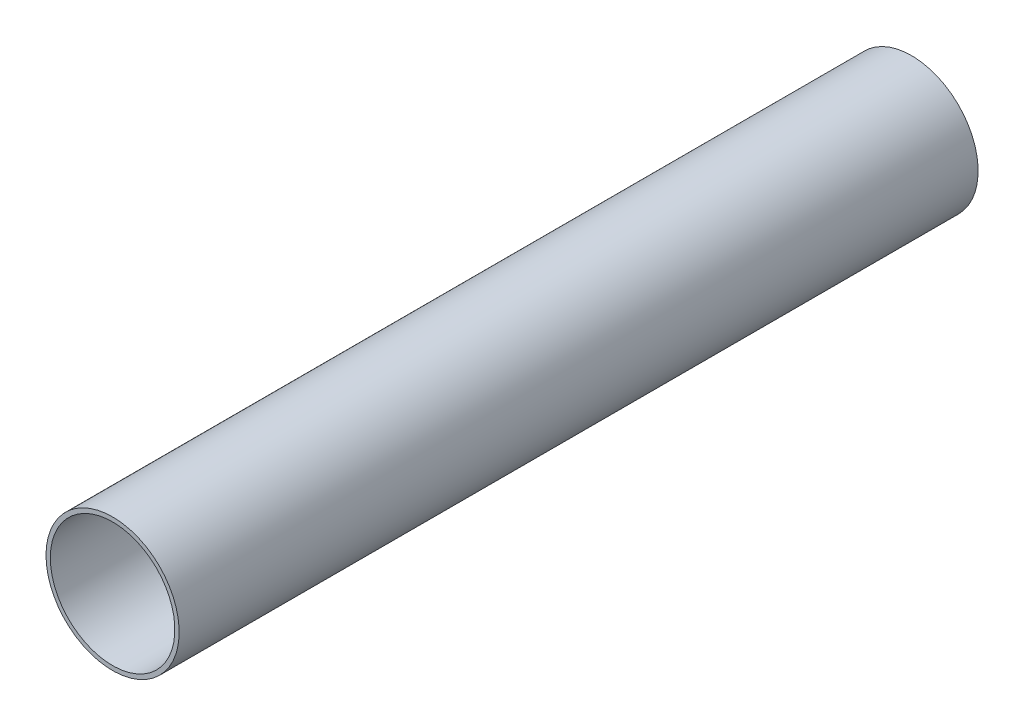
ISO-10303-21;
HEADER;
FILE_DESCRIPTION(('STEP AP214'),'2;1');
FILE_NAME('part.step','',(''),(''),'','','');
FILE_SCHEMA(('AUTOMOTIVE_DESIGN { 1 0 10303 214 1 1 1 1 }'));
ENDSEC;
DATA;
#1=APPLICATION_CONTEXT('core data for automotive mechanical design processes');
#2=APPLICATION_PROTOCOL_DEFINITION('international standard','automotive_design',2000,#1);
#3=PRODUCT_CONTEXT('',#1,'mechanical');
#4=PRODUCT('Part','Part','',(#3));
#5=PRODUCT_RELATED_PRODUCT_CATEGORY('part','',(#4));
#6=PRODUCT_DEFINITION_FORMATION('','',#4);
#7=PRODUCT_DEFINITION_CONTEXT('part definition',#1,'design');
#8=PRODUCT_DEFINITION('design','',#6,#7);
#9=PRODUCT_DEFINITION_SHAPE('','',#8);
#10=(LENGTH_UNIT() NAMED_UNIT(*) SI_UNIT(.MILLI.,.METRE.));
#11=(NAMED_UNIT(*) PLANE_ANGLE_UNIT() SI_UNIT($,.RADIAN.));
#12=(NAMED_UNIT(*) SI_UNIT($,.STERADIAN.) SOLID_ANGLE_UNIT());
#13=UNCERTAINTY_MEASURE_WITH_UNIT(LENGTH_MEASURE(1.E-05),#10,'distance_accuracy_value','');
#14=(GEOMETRIC_REPRESENTATION_CONTEXT(3) GLOBAL_UNCERTAINTY_ASSIGNED_CONTEXT((#13)) GLOBAL_UNIT_ASSIGNED_CONTEXT((#10,
#11,#12)) REPRESENTATION_CONTEXT('',''));
#15=CARTESIAN_POINT('',(0.,0.,0.));
#16=DIRECTION('',(0.,0.,1.));
#17=DIRECTION('',(1.,0.,0.));
#18=AXIS2_PLACEMENT_3D('',#15,#16,#17);
#19=CARTESIAN_POINT('',(0.,0.,152.4));
#20=DIRECTION('',(0.,0.,1.));
#21=DIRECTION('',(1.,0.,0.));
#22=AXIS2_PLACEMENT_3D('',#19,#20,#21);
#23=PLANE('',#22);
#24=CARTESIAN_POINT('',(0.,0.,152.4));
#25=DIRECTION('',(0.,0.,1.));
#26=DIRECTION('',(1.,0.,0.));
#27=AXIS2_PLACEMENT_3D('',#24,#25,#26);
#28=CIRCLE('',#27,25.4);
#29=CARTESIAN_POINT('',(-25.4,0.,152.4));
#30=VERTEX_POINT('',#29);
#31=EDGE_CURVE('E10',#30,#30,#28,.T.);
#32=ORIENTED_EDGE('',*,*,#31,.T.);
#33=EDGE_LOOP('',(#32));
#34=FACE_BOUND('',#33,.T.);
#35=CARTESIAN_POINT('',(0.,0.,152.4));
#36=DIRECTION('',(0.,0.,1.));
#37=DIRECTION('',(1.,0.,0.));
#38=AXIS2_PLACEMENT_3D('',#35,#36,#37);
#39=CIRCLE('',#38,23.749);
#40=CARTESIAN_POINT('',(-23.749,0.,152.4));
#41=VERTEX_POINT('',#40);
#42=EDGE_CURVE('E46',#41,#41,#39,.T.);
#43=ORIENTED_EDGE('',*,*,#42,.F.);
#44=EDGE_LOOP('',(#43));
#45=FACE_BOUND('',#44,.T.);
#46=ADVANCED_FACE('F35',(#34,#45),#23,.T.);
#47=CARTESIAN_POINT('',(0.,0.,-152.4));
#48=DIRECTION('',(0.,0.,1.));
#49=DIRECTION('',(1.,0.,0.));
#50=AXIS2_PLACEMENT_3D('',#47,#48,#49);
#51=PLANE('',#50);
#52=CARTESIAN_POINT('',(0.,0.,-152.4));
#53=DIRECTION('',(0.,0.,1.));
#54=DIRECTION('',(1.,0.,0.));
#55=AXIS2_PLACEMENT_3D('',#52,#53,#54);
#56=CIRCLE('',#55,25.4);
#57=CARTESIAN_POINT('',(-25.4,0.,-152.4));
#58=VERTEX_POINT('',#57);
#59=EDGE_CURVE('E39',#58,#58,#56,.T.);
#60=ORIENTED_EDGE('',*,*,#59,.F.);
#61=EDGE_LOOP('',(#60));
#62=FACE_BOUND('',#61,.T.);
#63=CARTESIAN_POINT('',(0.,0.,-152.4));
#64=DIRECTION('',(0.,0.,1.));
#65=DIRECTION('',(1.,0.,0.));
#66=AXIS2_PLACEMENT_3D('',#63,#64,#65);
#67=CIRCLE('',#66,23.749);
#68=CARTESIAN_POINT('',(-23.749,0.,-152.4));
#69=VERTEX_POINT('',#68);
#70=EDGE_CURVE('E48',#69,#69,#67,.T.);
#71=ORIENTED_EDGE('',*,*,#70,.T.);
#72=EDGE_LOOP('',(#71));
#73=FACE_BOUND('',#72,.T.);
#74=ADVANCED_FACE('F58',(#62,#73),#51,.F.);
#75=CARTESIAN_POINT('',(0.,0.,152.4));
#76=DIRECTION('',(0.,0.,-1.));
#77=DIRECTION('',(-1.,0.,0.));
#78=AXIS2_PLACEMENT_3D('',#75,#76,#77);
#79=CYLINDRICAL_SURFACE('',#78,25.4);
#80=CARTESIAN_POINT('',(-25.4,0.,152.4));
#81=CARTESIAN_POINT('',(-25.4,0.,149.225));
#82=CARTESIAN_POINT('',(-25.4,0.,146.05));
#83=CARTESIAN_POINT('',(-25.4,0.,139.7));
#84=CARTESIAN_POINT('',(-25.4,0.,136.525));
#85=CARTESIAN_POINT('',(-25.4,0.,130.175));
#86=CARTESIAN_POINT('',(-25.4,0.,127.));
#87=CARTESIAN_POINT('',(-25.4,0.,120.65));
#88=CARTESIAN_POINT('',(-25.4,0.,117.475));
#89=CARTESIAN_POINT('',(-25.4,0.,111.125));
#90=CARTESIAN_POINT('',(-25.4,0.,107.95));
#91=CARTESIAN_POINT('',(-25.4,0.,101.6));
#92=CARTESIAN_POINT('',(-25.4,0.,98.425));
#93=CARTESIAN_POINT('',(-25.4,0.,92.075));
#94=CARTESIAN_POINT('',(-25.4,0.,88.9));
#95=CARTESIAN_POINT('',(-25.4,0.,82.55));
#96=CARTESIAN_POINT('',(-25.4,0.,79.375));
#97=CARTESIAN_POINT('',(-25.4,0.,73.025));
#98=CARTESIAN_POINT('',(-25.4,0.,69.85));
#99=CARTESIAN_POINT('',(-25.4,0.,63.5));
#100=CARTESIAN_POINT('',(-25.4,0.,60.325));
#101=CARTESIAN_POINT('',(-25.4,0.,53.975));
#102=CARTESIAN_POINT('',(-25.4,0.,50.8));
#103=CARTESIAN_POINT('',(-25.4,0.,44.45));
#104=CARTESIAN_POINT('',(-25.4,0.,41.275));
#105=CARTESIAN_POINT('',(-25.4,0.,34.925));
#106=CARTESIAN_POINT('',(-25.4,0.,31.75));
#107=CARTESIAN_POINT('',(-25.4,0.,25.4));
#108=CARTESIAN_POINT('',(-25.4,0.,22.225));
#109=CARTESIAN_POINT('',(-25.4,0.,15.875));
#110=CARTESIAN_POINT('',(-25.4,0.,12.7));
#111=CARTESIAN_POINT('',(-25.4,0.,6.35));
#112=CARTESIAN_POINT('',(-25.4,0.,3.175));
#113=CARTESIAN_POINT('',(-25.4,0.,-3.175));
#114=CARTESIAN_POINT('',(-25.4,0.,-6.35));
#115=CARTESIAN_POINT('',(-25.4,0.,-12.7));
#116=CARTESIAN_POINT('',(-25.4,0.,-15.875));
#117=CARTESIAN_POINT('',(-25.4,0.,-22.225));
#118=CARTESIAN_POINT('',(-25.4,0.,-25.4));
#119=CARTESIAN_POINT('',(-25.4,0.,-31.75));
#120=CARTESIAN_POINT('',(-25.4,0.,-34.925));
#121=CARTESIAN_POINT('',(-25.4,0.,-41.275));
#122=CARTESIAN_POINT('',(-25.4,0.,-44.45));
#123=CARTESIAN_POINT('',(-25.4,0.,-50.8));
#124=CARTESIAN_POINT('',(-25.4,0.,-53.975));
#125=CARTESIAN_POINT('',(-25.4,0.,-60.325));
#126=CARTESIAN_POINT('',(-25.4,0.,-63.5));
#127=CARTESIAN_POINT('',(-25.4,0.,-69.85));
#128=CARTESIAN_POINT('',(-25.4,0.,-73.025));
#129=CARTESIAN_POINT('',(-25.4,0.,-79.375));
#130=CARTESIAN_POINT('',(-25.4,0.,-82.55));
#131=CARTESIAN_POINT('',(-25.4,0.,-88.9));
#132=CARTESIAN_POINT('',(-25.4,0.,-92.075));
#133=CARTESIAN_POINT('',(-25.4,0.,-98.425));
#134=CARTESIAN_POINT('',(-25.4,0.,-101.6));
#135=CARTESIAN_POINT('',(-25.4,0.,-107.95));
#136=CARTESIAN_POINT('',(-25.4,0.,-111.125));
#137=CARTESIAN_POINT('',(-25.4,0.,-117.475));
#138=CARTESIAN_POINT('',(-25.4,0.,-120.65));
#139=CARTESIAN_POINT('',(-25.4,0.,-127.));
#140=CARTESIAN_POINT('',(-25.4,0.,-130.175));
#141=CARTESIAN_POINT('',(-25.4,0.,-136.525));
#142=CARTESIAN_POINT('',(-25.4,0.,-139.7));
#143=CARTESIAN_POINT('',(-25.4,0.,-146.05));
#144=CARTESIAN_POINT('',(-25.4,0.,-149.225));
#145=CARTESIAN_POINT('',(-25.4,0.,-152.4));
#146=B_SPLINE_CURVE_WITH_KNOTS('',3,(#80,#81,#82,#83,#84,#85,#86,#87,#88,#89,#90,#91,#92,#93,
#94,#95,#96,#97,#98,#99,#100,#101,#102,#103,#104,#105,#106,#107,#108,#109,#110,#111,#112,#113,
#114,#115,#116,#117,#118,#119,#120,#121,#122,#123,#124,#125,#126,#127,#128,#129,#130,#131,#132,
#133,#134,#135,#136,#137,#138,#139,#140,#141,#142,#143,#144,#145),.UNSPECIFIED.,.F.,.F.,(4,2,2,
2,2,2,2,2,2,2,2,2,2,2,2,2,2,2,2,2,2,2,2,2,2,2,2,2,2,2,2,2,4),(0.,9.52500000000001,19.05,28.575,
38.1,47.625,57.15,66.675,76.2,85.725,95.25,104.775,114.3,123.825,133.35,142.875,152.4,161.925,
171.45,180.975,190.5,200.025,209.55,219.075,228.6,238.125,247.65,257.175,266.7,276.225,285.75,
295.275,304.8),.UNSPECIFIED.);
#147=EDGE_CURVE('BSEAM37',#30,#58,#146,.T.);
#148=ORIENTED_EDGE('',*,*,#31,.F.);
#149=ORIENTED_EDGE('',*,*,#59,.T.);
#150=ORIENTED_EDGE('',*,*,#147,.T.);
#151=ORIENTED_EDGE('',*,*,#147,.F.);
#152=EDGE_LOOP('',(#148,#150,#149,#151));
#153=FACE_BOUND('',#152,.T.);
#154=ADVANCED_FACE('F37',(#153),#79,.T.);
#155=CARTESIAN_POINT('',(0.,0.,152.4));
#156=DIRECTION('',(0.,0.,-1.));
#157=DIRECTION('',(-1.,0.,0.));
#158=AXIS2_PLACEMENT_3D('',#155,#156,#157);
#159=CYLINDRICAL_SURFACE('',#158,23.749);
#160=CARTESIAN_POINT('',(-23.749,0.,152.4));
#161=CARTESIAN_POINT('',(-23.749,0.,149.225));
#162=CARTESIAN_POINT('',(-23.749,0.,146.05));
#163=CARTESIAN_POINT('',(-23.749,0.,139.7));
#164=CARTESIAN_POINT('',(-23.749,0.,136.525));
#165=CARTESIAN_POINT('',(-23.749,0.,130.175));
#166=CARTESIAN_POINT('',(-23.749,0.,127.));
#167=CARTESIAN_POINT('',(-23.749,0.,120.65));
#168=CARTESIAN_POINT('',(-23.749,0.,117.475));
#169=CARTESIAN_POINT('',(-23.749,0.,111.125));
#170=CARTESIAN_POINT('',(-23.749,0.,107.95));
#171=CARTESIAN_POINT('',(-23.749,0.,101.6));
#172=CARTESIAN_POINT('',(-23.749,0.,98.425));
#173=CARTESIAN_POINT('',(-23.749,0.,92.075));
#174=CARTESIAN_POINT('',(-23.749,0.,88.9));
#175=CARTESIAN_POINT('',(-23.749,0.,82.55));
#176=CARTESIAN_POINT('',(-23.749,0.,79.375));
#177=CARTESIAN_POINT('',(-23.749,0.,73.025));
#178=CARTESIAN_POINT('',(-23.749,0.,69.85));
#179=CARTESIAN_POINT('',(-23.749,0.,63.5));
#180=CARTESIAN_POINT('',(-23.749,0.,60.325));
#181=CARTESIAN_POINT('',(-23.749,0.,53.975));
#182=CARTESIAN_POINT('',(-23.749,0.,50.8));
#183=CARTESIAN_POINT('',(-23.749,0.,44.45));
#184=CARTESIAN_POINT('',(-23.749,0.,41.275));
#185=CARTESIAN_POINT('',(-23.749,0.,34.925));
#186=CARTESIAN_POINT('',(-23.749,0.,31.75));
#187=CARTESIAN_POINT('',(-23.749,0.,25.4));
#188=CARTESIAN_POINT('',(-23.749,0.,22.225));
#189=CARTESIAN_POINT('',(-23.749,0.,15.875));
#190=CARTESIAN_POINT('',(-23.749,0.,12.7));
#191=CARTESIAN_POINT('',(-23.749,0.,6.34999999999998));
#192=CARTESIAN_POINT('',(-23.749,0.,3.17499999999997));
#193=CARTESIAN_POINT('',(-23.749,0.,-3.17500000000003));
#194=CARTESIAN_POINT('',(-23.749,0.,-6.35000000000003));
#195=CARTESIAN_POINT('',(-23.749,0.,-12.7));
#196=CARTESIAN_POINT('',(-23.749,0.,-15.875));
#197=CARTESIAN_POINT('',(-23.749,0.,-22.225));
#198=CARTESIAN_POINT('',(-23.749,0.,-25.4));
#199=CARTESIAN_POINT('',(-23.749,0.,-31.75));
#200=CARTESIAN_POINT('',(-23.749,0.,-34.925));
#201=CARTESIAN_POINT('',(-23.749,0.,-41.275));
#202=CARTESIAN_POINT('',(-23.749,0.,-44.45));
#203=CARTESIAN_POINT('',(-23.749,0.,-50.8));
#204=CARTESIAN_POINT('',(-23.749,0.,-53.975));
#205=CARTESIAN_POINT('',(-23.749,0.,-60.325));
#206=CARTESIAN_POINT('',(-23.749,0.,-63.5));
#207=CARTESIAN_POINT('',(-23.749,0.,-69.85));
#208=CARTESIAN_POINT('',(-23.749,0.,-73.025));
#209=CARTESIAN_POINT('',(-23.749,0.,-79.375));
#210=CARTESIAN_POINT('',(-23.749,0.,-82.5500000000001));
#211=CARTESIAN_POINT('',(-23.749,0.,-88.9));
#212=CARTESIAN_POINT('',(-23.749,0.,-92.0750000000001));
#213=CARTESIAN_POINT('',(-23.749,0.,-98.425));
#214=CARTESIAN_POINT('',(-23.749,0.,-101.6));
#215=CARTESIAN_POINT('',(-23.749,0.,-107.95));
#216=CARTESIAN_POINT('',(-23.749,0.,-111.125));
#217=CARTESIAN_POINT('',(-23.749,0.,-117.475));
#218=CARTESIAN_POINT('',(-23.749,0.,-120.65));
#219=CARTESIAN_POINT('',(-23.749,0.,-127.));
#220=CARTESIAN_POINT('',(-23.749,0.,-130.175));
#221=CARTESIAN_POINT('',(-23.749,0.,-136.525));
#222=CARTESIAN_POINT('',(-23.749,0.,-139.7));
#223=CARTESIAN_POINT('',(-23.749,0.,-146.05));
#224=CARTESIAN_POINT('',(-23.749,0.,-149.225));
#225=CARTESIAN_POINT('',(-23.749,0.,-152.4));
#226=B_SPLINE_CURVE_WITH_KNOTS('',3,(#160,#161,#162,#163,#164,#165,#166,#167,#168,#169,#170,
#171,#172,#173,#174,#175,#176,#177,#178,#179,#180,#181,#182,#183,#184,#185,#186,#187,#188,#189,
#190,#191,#192,#193,#194,#195,#196,#197,#198,#199,#200,#201,#202,#203,#204,#205,#206,#207,#208,
#209,#210,#211,#212,#213,#214,#215,#216,#217,#218,#219,#220,#221,#222,#223,#224,#225),
.UNSPECIFIED.,.F.,.F.,(4,2,2,2,2,2,2,2,2,2,2,2,2,2,2,2,2,2,2,2,2,2,2,2,2,2,2,2,2,2,2,2,4),(0.,
9.52499999999998,19.05,28.575,38.1,47.625,57.15,66.675,76.2,85.725,95.25,104.775,114.3,123.825,
133.35,142.875,152.4,161.925,171.45,180.975,190.5,200.025,209.55,219.075,228.6,238.125,247.65,
257.175,266.7,276.225,285.75,295.275,304.8),.UNSPECIFIED.);
#227=EDGE_CURVE('BSEAM54',#41,#69,#226,.T.);
#228=ORIENTED_EDGE('',*,*,#42,.T.);
#229=ORIENTED_EDGE('',*,*,#70,.F.);
#230=ORIENTED_EDGE('',*,*,#227,.T.);
#231=ORIENTED_EDGE('',*,*,#227,.F.);
#232=EDGE_LOOP('',(#228,#230,#229,#231));
#233=FACE_BOUND('',#232,.T.);
#234=ADVANCED_FACE('F54',(#233),#159,.F.);
#235=CLOSED_SHELL('',(#46,#74,#154,#234));
#236=MANIFOLD_SOLID_BREP('B2',#235);
#237=ADVANCED_BREP_SHAPE_REPRESENTATION('',(#18,#236),#14);
#238=SHAPE_DEFINITION_REPRESENTATION(#9,#237);
ENDSEC;
END-ISO-10303-21;
